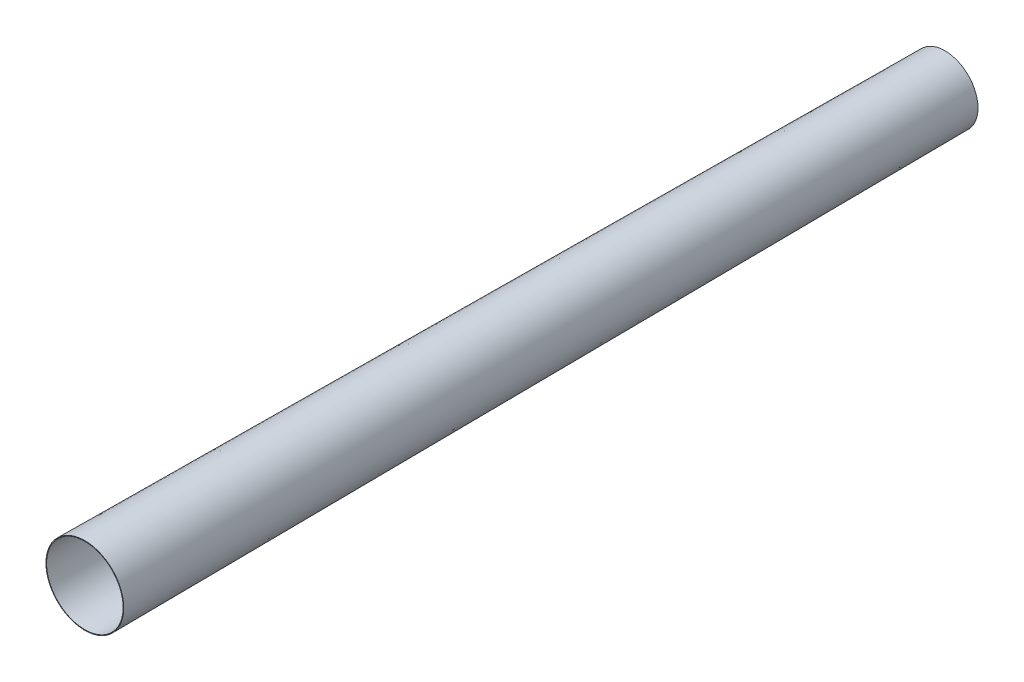
ISO-10303-21;
HEADER;
FILE_DESCRIPTION(('STEP AP214'),'2;1');
FILE_NAME('part.step','',(''),(''),'','','');
FILE_SCHEMA(('AUTOMOTIVE_DESIGN { 1 0 10303 214 1 1 1 1 }'));
ENDSEC;
DATA;
#1=APPLICATION_CONTEXT('core data for automotive mechanical design processes');
#2=APPLICATION_PROTOCOL_DEFINITION('international standard','automotive_design',2000,#1);
#3=PRODUCT_CONTEXT('',#1,'mechanical');
#4=PRODUCT('Part','Part','',(#3));
#5=PRODUCT_RELATED_PRODUCT_CATEGORY('part','',(#4));
#6=PRODUCT_DEFINITION_FORMATION('','',#4);
#7=PRODUCT_DEFINITION_CONTEXT('part definition',#1,'design');
#8=PRODUCT_DEFINITION('design','',#6,#7);
#9=PRODUCT_DEFINITION_SHAPE('','',#8);
#10=(LENGTH_UNIT() NAMED_UNIT(*) SI_UNIT(.MILLI.,.METRE.));
#11=(NAMED_UNIT(*) PLANE_ANGLE_UNIT() SI_UNIT($,.RADIAN.));
#12=(NAMED_UNIT(*) SI_UNIT($,.STERADIAN.) SOLID_ANGLE_UNIT());
#13=UNCERTAINTY_MEASURE_WITH_UNIT(LENGTH_MEASURE(1.E-05),#10,'distance_accuracy_value','');
#14=(GEOMETRIC_REPRESENTATION_CONTEXT(3) GLOBAL_UNCERTAINTY_ASSIGNED_CONTEXT((#13)) GLOBAL_UNIT_ASSIGNED_CONTEXT((#10,
#11,#12)) REPRESENTATION_CONTEXT('',''));
#15=CARTESIAN_POINT('',(0.,0.,0.));
#16=DIRECTION('',(0.,0.,1.));
#17=DIRECTION('',(1.,0.,0.));
#18=AXIS2_PLACEMENT_3D('',#15,#16,#17);
#19=CARTESIAN_POINT('',(0.,0.,700.99461252));
#20=DIRECTION('',(0.,0.,1.));
#21=DIRECTION('',(1.,0.,0.));
#22=AXIS2_PLACEMENT_3D('',#19,#20,#21);
#23=PLANE('',#22);
#24=CARTESIAN_POINT('',(0.,0.,700.99461252));
#25=DIRECTION('',(0.,0.,1.));
#26=DIRECTION('',(1.,0.,0.));
#27=AXIS2_PLACEMENT_3D('',#24,#25,#26);
#28=CIRCLE('',#27,31.2032623774189);
#29=CARTESIAN_POINT('',(31.2032623774189,0.,700.99461252));
#30=VERTEX_POINT('',#29);
#31=EDGE_CURVE('E54',#30,#30,#28,.T.);
#32=ORIENTED_EDGE('',*,*,#31,.F.);
#33=EDGE_LOOP('',(#32));
#34=FACE_BOUND('',#33,.T.);
#35=CARTESIAN_POINT('',(0.,0.,700.99461252));
#36=DIRECTION('',(0.,0.,1.));
#37=DIRECTION('',(1.,0.,0.));
#38=AXIS2_PLACEMENT_3D('',#35,#36,#37);
#39=CIRCLE('',#38,31.7032739328637);
#40=CARTESIAN_POINT('',(31.7032739328637,0.,700.99461252));
#41=VERTEX_POINT('',#40);
#42=EDGE_CURVE('E11',#41,#41,#39,.T.);
#43=ORIENTED_EDGE('',*,*,#42,.T.);
#44=EDGE_LOOP('',(#43));
#45=FACE_BOUND('',#44,.T.);
#46=ADVANCED_FACE('F39',(#34,#45),#23,.T.);
#47=CARTESIAN_POINT('',(0.,0.,0.));
#48=DIRECTION('',(0.,0.,1.));
#49=DIRECTION('',(1.,0.,0.));
#50=AXIS2_PLACEMENT_3D('',#47,#48,#49);
#51=PLANE('',#50);
#52=CARTESIAN_POINT('',(0.,0.,0.));
#53=DIRECTION('',(0.,0.,1.));
#54=DIRECTION('',(1.,0.,0.));
#55=AXIS2_PLACEMENT_3D('',#52,#53,#54);
#56=CIRCLE('',#55,26.4374107404524);
#57=CARTESIAN_POINT('',(26.4374107404524,0.,0.));
#58=VERTEX_POINT('',#57);
#59=EDGE_CURVE('E111',#58,#58,#56,.T.);
#60=ORIENTED_EDGE('',*,*,#59,.T.);
#61=EDGE_LOOP('',(#60));
#62=FACE_BOUND('',#61,.T.);
#63=CARTESIAN_POINT('',(0.,0.,0.));
#64=DIRECTION('',(0.,0.,1.));
#65=DIRECTION('',(1.,0.,0.));
#66=AXIS2_PLACEMENT_3D('',#63,#64,#65);
#67=CIRCLE('',#66,26.9374222958972);
#68=CARTESIAN_POINT('',(26.9374222958972,0.,0.));
#69=VERTEX_POINT('',#68);
#70=EDGE_CURVE('E48',#69,#69,#67,.T.);
#71=ORIENTED_EDGE('',*,*,#70,.F.);
#72=EDGE_LOOP('',(#71));
#73=FACE_BOUND('',#72,.T.);
#74=ADVANCED_FACE('F73',(#62,#73),#51,.F.);
#75=CARTESIAN_POINT('',(0.,0.,0.));
#76=DIRECTION('',(0.,0.,1.));
#77=DIRECTION('',(1.,0.,0.));
#78=AXIS2_PLACEMENT_3D('',#75,#76,#77);
#79=CONICAL_SURFACE('',#78,26.9374222958972,0.00679859463157347);
#80=ORIENTED_EDGE('',*,*,#70,.T.);
#81=EDGE_LOOP('',(#80));
#82=FACE_BOUND('',#81,.T.);
#83=ORIENTED_EDGE('',*,*,#42,.F.);
#84=EDGE_LOOP('',(#83));
#85=FACE_BOUND('',#84,.T.);
#86=ADVANCED_FACE('F82',(#82,#85),#79,.T.);
#87=CARTESIAN_POINT('',(0.,0.,0.00339927112942329));
#88=DIRECTION('',(0.,0.,1.));
#89=DIRECTION('',(1.,0.,0.));
#90=AXIS2_PLACEMENT_3D('',#87,#88,#89);
#91=CONICAL_SURFACE('',#90,26.437433851075,0.00679859463157347);
#92=ORIENTED_EDGE('',*,*,#59,.F.);
#93=EDGE_LOOP('',(#92));
#94=FACE_BOUND('',#93,.T.);
#95=ORIENTED_EDGE('',*,*,#31,.T.);
#96=EDGE_LOOP('',(#95));
#97=FACE_BOUND('',#96,.T.);
#98=ADVANCED_FACE('F84',(#94,#97),#91,.F.);
#99=CLOSED_SHELL('',(#46,#74,#86,#98));
#100=MANIFOLD_SOLID_BREP('B2',#99);
#101=ADVANCED_BREP_SHAPE_REPRESENTATION('',(#18,#100),#14);
#102=SHAPE_DEFINITION_REPRESENTATION(#9,#101);
ENDSEC;
END-ISO-10303-21;
